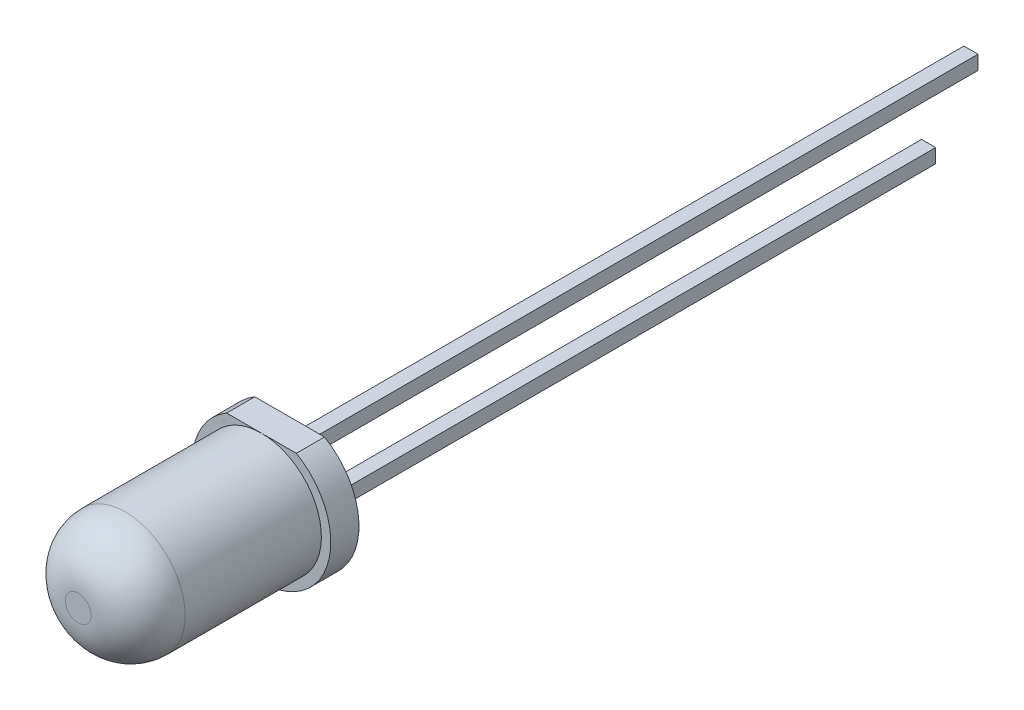
ISO-10303-21;
HEADER;
FILE_DESCRIPTION(('STEP AP214'),'2;1');
FILE_NAME('part.step','',(''),(''),'','','');
FILE_SCHEMA(('AUTOMOTIVE_DESIGN { 1 0 10303 214 1 1 1 1 }'));
ENDSEC;
DATA;
#1=APPLICATION_CONTEXT('core data for automotive mechanical design processes');
#2=APPLICATION_PROTOCOL_DEFINITION('international standard','automotive_design',2000,#1);
#3=PRODUCT_CONTEXT('',#1,'mechanical');
#4=PRODUCT('Part','Part','',(#3));
#5=PRODUCT_RELATED_PRODUCT_CATEGORY('part','',(#4));
#6=PRODUCT_DEFINITION_FORMATION('','',#4);
#7=PRODUCT_DEFINITION_CONTEXT('part definition',#1,'design');
#8=PRODUCT_DEFINITION('design','',#6,#7);
#9=PRODUCT_DEFINITION_SHAPE('','',#8);
#10=(LENGTH_UNIT() NAMED_UNIT(*) SI_UNIT(.MILLI.,.METRE.));
#11=(NAMED_UNIT(*) PLANE_ANGLE_UNIT() SI_UNIT($,.RADIAN.));
#12=(NAMED_UNIT(*) SI_UNIT($,.STERADIAN.) SOLID_ANGLE_UNIT());
#13=UNCERTAINTY_MEASURE_WITH_UNIT(LENGTH_MEASURE(1.E-05),#10,'distance_accuracy_value','');
#14=(GEOMETRIC_REPRESENTATION_CONTEXT(3) GLOBAL_UNCERTAINTY_ASSIGNED_CONTEXT((#13)) GLOBAL_UNIT_ASSIGNED_CONTEXT((#10,
#11,#12)) REPRESENTATION_CONTEXT('',''));
#15=CARTESIAN_POINT('',(0.,0.,0.));
#16=DIRECTION('',(0.,0.,1.));
#17=DIRECTION('',(1.,0.,0.));
#18=AXIS2_PLACEMENT_3D('',#15,#16,#17);
#19=CARTESIAN_POINT('',(-0.25,-0.5,3.3));
#20=DIRECTION('',(0.,0.,1.));
#21=DIRECTION('',(1.,0.,0.));
#22=AXIS2_PLACEMENT_3D('',#19,#20,#21);
#23=PLANE('',#22);
#24=DIRECTION('',(1.,0.,0.));
#25=VECTOR('',#24,1.);
#26=CARTESIAN_POINT('',(-0.25,-0.5,3.3));
#27=LINE('',#26,#25);
#28=CARTESIAN_POINT('',(-0.25,-0.5,3.3));
#29=VERTEX_POINT('',#28);
#30=CARTESIAN_POINT('',(0.25,-0.5,3.3));
#31=VERTEX_POINT('',#30);
#32=EDGE_CURVE('E55',#29,#31,#27,.T.);
#33=ORIENTED_EDGE('',*,*,#32,.T.);
#34=DIRECTION('',(0.,-1.,0.));
#35=VECTOR('',#34,1.);
#36=CARTESIAN_POINT('',(0.25,-0.5,3.3));
#37=LINE('',#36,#35);
#38=CARTESIAN_POINT('',(0.25,0.5,3.3));
#39=VERTEX_POINT('',#38);
#40=EDGE_CURVE('E92',#39,#31,#37,.T.);
#41=ORIENTED_EDGE('',*,*,#40,.F.);
#42=DIRECTION('',(1.,0.,0.));
#43=VECTOR('',#42,1.);
#44=CARTESIAN_POINT('',(-0.25,0.5,3.3));
#45=LINE('',#44,#43);
#46=CARTESIAN_POINT('',(-0.25,0.5,3.3));
#47=VERTEX_POINT('',#46);
#48=EDGE_CURVE('E12',#47,#39,#45,.T.);
#49=ORIENTED_EDGE('',*,*,#48,.F.);
#50=DIRECTION('',(0.,-1.,0.));
#51=VECTOR('',#50,1.);
#52=CARTESIAN_POINT('',(-0.25,-0.5,3.3));
#53=LINE('',#52,#51);
#54=EDGE_CURVE('E93',#47,#29,#53,.T.);
#55=ORIENTED_EDGE('',*,*,#54,.T.);
#56=EDGE_LOOP('',(#33,#41,#49,#55));
#57=FACE_BOUND('',#56,.T.);
#58=ADVANCED_FACE('F52',(#57),#23,.T.);
#59=CARTESIAN_POINT('',(-0.25,0.5,3.1));
#60=DIRECTION('',(0.,1.,0.));
#61=DIRECTION('',(0.,0.,1.));
#62=AXIS2_PLACEMENT_3D('',#59,#60,#61);
#63=PLANE('',#62);
#64=ORIENTED_EDGE('',*,*,#48,.T.);
#65=DIRECTION('',(0.,0.,1.));
#66=VECTOR('',#65,1.);
#67=CARTESIAN_POINT('',(0.25,0.5,3.1));
#68=LINE('',#67,#66);
#69=CARTESIAN_POINT('',(0.25,0.5,3.1));
#70=VERTEX_POINT('',#69);
#71=EDGE_CURVE('E109',#70,#39,#68,.T.);
#72=ORIENTED_EDGE('',*,*,#71,.F.);
#73=DIRECTION('',(1.,0.,0.));
#74=VECTOR('',#73,1.);
#75=CARTESIAN_POINT('',(-0.25,0.5,3.1));
#76=LINE('',#75,#74);
#77=CARTESIAN_POINT('',(-0.25,0.5,3.1));
#78=VERTEX_POINT('',#77);
#79=EDGE_CURVE('E60',#78,#70,#76,.T.);
#80=ORIENTED_EDGE('',*,*,#79,.F.);
#81=DIRECTION('',(0.,0.,1.));
#82=VECTOR('',#81,1.);
#83=CARTESIAN_POINT('',(-0.25,0.5,3.1));
#84=LINE('',#83,#82);
#85=EDGE_CURVE('E98',#78,#47,#84,.T.);
#86=ORIENTED_EDGE('',*,*,#85,.T.);
#87=EDGE_LOOP('',(#64,#72,#80,#86));
#88=FACE_BOUND('',#87,.T.);
#89=ADVANCED_FACE('F124',(#88),#63,.T.);
#90=CARTESIAN_POINT('',(-0.25,-0.5,3.1));
#91=DIRECTION('',(0.,0.,-1.));
#92=DIRECTION('',(-1.,0.,0.));
#93=AXIS2_PLACEMENT_3D('',#90,#91,#92);
#94=PLANE('',#93);
#95=ORIENTED_EDGE('',*,*,#79,.T.);
#96=DIRECTION('',(0.,1.,0.));
#97=VECTOR('',#96,1.);
#98=CARTESIAN_POINT('',(0.25,-0.5,3.1));
#99=LINE('',#98,#97);
#100=CARTESIAN_POINT('',(0.25,-0.5,3.1));
#101=VERTEX_POINT('',#100);
#102=EDGE_CURVE('E105',#101,#70,#99,.T.);
#103=ORIENTED_EDGE('',*,*,#102,.F.);
#104=DIRECTION('',(1.,0.,0.));
#105=VECTOR('',#104,1.);
#106=CARTESIAN_POINT('',(-0.25,-0.5,3.1));
#107=LINE('',#106,#105);
#108=CARTESIAN_POINT('',(-0.25,-0.5,3.1));
#109=VERTEX_POINT('',#108);
#110=EDGE_CURVE('E97',#109,#101,#107,.T.);
#111=ORIENTED_EDGE('',*,*,#110,.F.);
#112=DIRECTION('',(0.,1.,0.));
#113=VECTOR('',#112,1.);
#114=CARTESIAN_POINT('',(-0.25,-0.5,3.1));
#115=LINE('',#114,#113);
#116=EDGE_CURVE('E117',#109,#78,#115,.T.);
#117=ORIENTED_EDGE('',*,*,#116,.T.);
#118=EDGE_LOOP('',(#95,#103,#111,#117));
#119=FACE_BOUND('',#118,.T.);
#120=ADVANCED_FACE('F121',(#119),#94,.T.);
#121=CARTESIAN_POINT('',(-0.25,-0.5,3.1));
#122=DIRECTION('',(0.,-1.,0.));
#123=DIRECTION('',(0.,0.,-1.));
#124=AXIS2_PLACEMENT_3D('',#121,#122,#123);
#125=PLANE('',#124);
#126=ORIENTED_EDGE('',*,*,#110,.T.);
#127=DIRECTION('',(0.,0.,-1.));
#128=VECTOR('',#127,1.);
#129=CARTESIAN_POINT('',(0.25,-0.5,3.1));
#130=LINE('',#129,#128);
#131=EDGE_CURVE('E100',#31,#101,#130,.T.);
#132=ORIENTED_EDGE('',*,*,#131,.F.);
#133=ORIENTED_EDGE('',*,*,#32,.F.);
#134=DIRECTION('',(0.,0.,-1.));
#135=VECTOR('',#134,1.);
#136=CARTESIAN_POINT('',(-0.25,-0.5,3.1));
#137=LINE('',#136,#135);
#138=EDGE_CURVE('E115',#29,#109,#137,.T.);
#139=ORIENTED_EDGE('',*,*,#138,.T.);
#140=EDGE_LOOP('',(#126,#132,#133,#139));
#141=FACE_BOUND('',#140,.T.);
#142=ADVANCED_FACE('F101',(#141),#125,.T.);
#143=CARTESIAN_POINT('',(-0.25,0.,0.));
#144=DIRECTION('',(1.,0.,0.));
#145=DIRECTION('',(0.,0.,-1.));
#146=AXIS2_PLACEMENT_3D('',#143,#144,#145);
#147=PLANE('',#146);
#148=ORIENTED_EDGE('',*,*,#54,.F.);
#149=ORIENTED_EDGE('',*,*,#85,.F.);
#150=ORIENTED_EDGE('',*,*,#116,.F.);
#151=ORIENTED_EDGE('',*,*,#138,.F.);
#152=EDGE_LOOP('',(#148,#149,#150,#151));
#153=FACE_BOUND('',#152,.T.);
#154=ADVANCED_FACE('F126',(#153),#147,.F.);
#155=CARTESIAN_POINT('',(0.25,0.,0.));
#156=DIRECTION('',(1.,0.,0.));
#157=DIRECTION('',(0.,0.,-1.));
#158=AXIS2_PLACEMENT_3D('',#155,#156,#157);
#159=PLANE('',#158);
#160=ORIENTED_EDGE('',*,*,#40,.T.);
#161=ORIENTED_EDGE('',*,*,#131,.T.);
#162=ORIENTED_EDGE('',*,*,#102,.T.);
#163=ORIENTED_EDGE('',*,*,#71,.T.);
#164=EDGE_LOOP('',(#160,#161,#162,#163));
#165=FACE_BOUND('',#164,.T.);
#166=ADVANCED_FACE('F108',(#165),#159,.T.);
#167=CLOSED_SHELL('',(#58,#89,#120,#142,#154,#166));
#168=MANIFOLD_SOLID_BREP('B2',#167);
#169=CARTESIAN_POINT('',(0.,0.,1.2));
#170=DIRECTION('',(0.,0.,-1.));
#171=DIRECTION('',(-1.,0.,0.));
#172=AXIS2_PLACEMENT_3D('',#169,#170,#171);
#173=CYLINDRICAL_SURFACE('',#172,2.95);
#174=CARTESIAN_POINT('',(0.,0.,1.2));
#175=DIRECTION('',(0.,0.,1.));
#176=DIRECTION('',(1.,0.,0.));
#177=AXIS2_PLACEMENT_3D('',#174,#175,#176);
#178=CIRCLE('',#177,2.95);
#179=CARTESIAN_POINT('',(-1.48323969741914,2.55,1.2));
#180=VERTEX_POINT('',#179);
#181=CARTESIAN_POINT('',(1.48323969741914,2.55,1.2));
#182=VERTEX_POINT('',#181);
#183=EDGE_CURVE('E324',#180,#182,#178,.T.);
#184=ORIENTED_EDGE('',*,*,#183,.F.);
#185=DIRECTION('',(0.,0.,-1.));
#186=VECTOR('',#185,1.);
#187=CARTESIAN_POINT('',(-1.48323969741914,2.55,1.2));
#188=LINE('',#187,#186);
#189=CARTESIAN_POINT('',(-1.48323969741914,2.55,0.));
#190=VERTEX_POINT('',#189);
#191=EDGE_CURVE('E314',#180,#190,#188,.T.);
#192=ORIENTED_EDGE('',*,*,#191,.T.);
#193=CARTESIAN_POINT('',(0.,0.,0.));
#194=DIRECTION('',(0.,0.,1.));
#195=DIRECTION('',(1.,0.,0.));
#196=AXIS2_PLACEMENT_3D('',#193,#194,#195);
#197=CIRCLE('',#196,2.95);
#198=CARTESIAN_POINT('',(1.48323969741914,2.55,0.));
#199=VERTEX_POINT('',#198);
#200=EDGE_CURVE('E318',#190,#199,#197,.T.);
#201=ORIENTED_EDGE('',*,*,#200,.T.);
#202=DIRECTION('',(0.,0.,-1.));
#203=VECTOR('',#202,1.);
#204=CARTESIAN_POINT('',(1.48323969741914,2.55,1.2));
#205=LINE('',#204,#203);
#206=EDGE_CURVE('E310',#199,#182,#205,.F.);
#207=ORIENTED_EDGE('',*,*,#206,.T.);
#208=EDGE_LOOP('',(#184,#192,#201,#207));
#209=FACE_BOUND('',#208,.T.);
#210=ADVANCED_FACE('F192',(#209),#173,.T.);
#211=CARTESIAN_POINT('',(0.,0.,1.2));
#212=DIRECTION('',(0.,0.,1.));
#213=DIRECTION('',(1.,0.,0.));
#214=AXIS2_PLACEMENT_3D('',#211,#212,#213);
#215=PLANE('',#214);
#216=DIRECTION('',(1.,0.,0.));
#217=VECTOR('',#216,1.);
#218=CARTESIAN_POINT('',(-2.141777441338,2.55,1.2));
#219=LINE('',#218,#217);
#220=CARTESIAN_POINT('',(0.,2.55,1.2));
#221=VERTEX_POINT('',#220);
#222=EDGE_CURVE('E309',#180,#221,#219,.T.);
#223=ORIENTED_EDGE('',*,*,#222,.F.);
#224=ORIENTED_EDGE('',*,*,#183,.T.);
#225=EDGE_CURVE('E306',#221,#182,#219,.T.);
#226=ORIENTED_EDGE('',*,*,#225,.F.);
#227=CARTESIAN_POINT('',(0.,0.,1.2));
#228=DIRECTION('',(0.,0.,1.));
#229=DIRECTION('',(1.,0.,0.));
#230=AXIS2_PLACEMENT_3D('',#227,#228,#229);
#231=CIRCLE('',#230,2.55);
#232=EDGE_CURVE('E319',#221,#221,#231,.T.);
#233=ORIENTED_EDGE('',*,*,#232,.F.);
#234=EDGE_LOOP('',(#223,#224,#226,#233));
#235=FACE_BOUND('',#234,.T.);
#236=ADVANCED_FACE('F350',(#235),#215,.T.);
#237=CARTESIAN_POINT('',(0.,0.,0.));
#238=DIRECTION('',(0.,0.,1.));
#239=DIRECTION('',(1.,0.,0.));
#240=AXIS2_PLACEMENT_3D('',#237,#238,#239);
#241=PLANE('',#240);
#242=DIRECTION('',(0.,1.,0.));
#243=VECTOR('',#242,1.);
#244=CARTESIAN_POINT('',(0.3,0.97,0.));
#245=LINE('',#244,#243);
#246=CARTESIAN_POINT('',(0.3,0.97,0.));
#247=VERTEX_POINT('',#246);
#248=CARTESIAN_POINT('',(0.3,1.57,0.));
#249=VERTEX_POINT('',#248);
#250=EDGE_CURVE('E215',#247,#249,#245,.T.);
#251=ORIENTED_EDGE('',*,*,#250,.T.);
#252=DIRECTION('',(-1.,0.,0.));
#253=VECTOR('',#252,1.);
#254=CARTESIAN_POINT('',(0.3,1.57,0.));
#255=LINE('',#254,#253);
#256=CARTESIAN_POINT('',(-0.3,1.57,0.));
#257=VERTEX_POINT('',#256);
#258=EDGE_CURVE('E540',#249,#257,#255,.T.);
#259=ORIENTED_EDGE('',*,*,#258,.T.);
#260=DIRECTION('',(0.,1.,0.));
#261=VECTOR('',#260,1.);
#262=CARTESIAN_POINT('',(-0.3,0.97,0.));
#263=LINE('',#262,#261);
#264=CARTESIAN_POINT('',(-0.3,0.97,0.));
#265=VERTEX_POINT('',#264);
#266=EDGE_CURVE('E545',#265,#257,#263,.T.);
#267=ORIENTED_EDGE('',*,*,#266,.F.);
#268=DIRECTION('',(-1.,0.,0.));
#269=VECTOR('',#268,1.);
#270=CARTESIAN_POINT('',(0.3,0.97,0.));
#271=LINE('',#270,#269);
#272=EDGE_CURVE('E566',#247,#265,#271,.T.);
#273=ORIENTED_EDGE('',*,*,#272,.F.);
#274=EDGE_LOOP('',(#251,#259,#267,#273));
#275=FACE_BOUND('',#274,.T.);
#276=DIRECTION('',(0.,-1.,0.));
#277=VECTOR('',#276,1.);
#278=CARTESIAN_POINT('',(0.3,0.,0.));
#279=LINE('',#278,#277);
#280=CARTESIAN_POINT('',(0.3,-0.97,0.));
#281=VERTEX_POINT('',#280);
#282=CARTESIAN_POINT('',(0.3,-1.57,0.));
#283=VERTEX_POINT('',#282);
#284=EDGE_CURVE('E537',#281,#283,#279,.T.);
#285=ORIENTED_EDGE('',*,*,#284,.F.);
#286=DIRECTION('',(-1.,0.,0.));
#287=VECTOR('',#286,1.);
#288=CARTESIAN_POINT('',(0.,-0.97,0.));
#289=LINE('',#288,#287);
#290=CARTESIAN_POINT('',(-0.3,-0.97,0.));
#291=VERTEX_POINT('',#290);
#292=EDGE_CURVE('E538',#281,#291,#289,.T.);
#293=ORIENTED_EDGE('',*,*,#292,.T.);
#294=DIRECTION('',(0.,-1.,0.));
#295=VECTOR('',#294,1.);
#296=CARTESIAN_POINT('',(-0.3,0.,0.));
#297=LINE('',#296,#295);
#298=CARTESIAN_POINT('',(-0.3,-1.57,0.));
#299=VERTEX_POINT('',#298);
#300=EDGE_CURVE('E289',#291,#299,#297,.T.);
#301=ORIENTED_EDGE('',*,*,#300,.T.);
#302=DIRECTION('',(-1.,0.,0.));
#303=VECTOR('',#302,1.);
#304=CARTESIAN_POINT('',(0.,-1.57,0.));
#305=LINE('',#304,#303);
#306=EDGE_CURVE('E298',#283,#299,#305,.T.);
#307=ORIENTED_EDGE('',*,*,#306,.F.);
#308=EDGE_LOOP('',(#285,#293,#301,#307));
#309=FACE_BOUND('',#308,.T.);
#310=ORIENTED_EDGE('',*,*,#200,.F.);
#311=DIRECTION('',(1.,0.,0.));
#312=VECTOR('',#311,1.);
#313=CARTESIAN_POINT('',(0.,2.55,0.));
#314=LINE('',#313,#312);
#315=EDGE_CURVE('E201',#190,#199,#314,.T.);
#316=ORIENTED_EDGE('',*,*,#315,.T.);
#317=EDGE_LOOP('',(#310,#316));
#318=FACE_BOUND('',#317,.T.);
#319=ADVANCED_FACE('F341',(#275,#309,#318),#241,.F.);
#320=CARTESIAN_POINT('',(0.,0.,9.));
#321=DIRECTION('',(0.,0.,-1.));
#322=DIRECTION('',(-1.,0.,0.));
#323=AXIS2_PLACEMENT_3D('',#320,#321,#322);
#324=CYLINDRICAL_SURFACE('',#323,2.55);
#325=CARTESIAN_POINT('',(0.,0.,7.));
#326=DIRECTION('',(0.,0.,1.));
#327=DIRECTION('',(1.,0.,0.));
#328=AXIS2_PLACEMENT_3D('',#325,#326,#327);
#329=CIRCLE('',#328,2.55);
#330=CARTESIAN_POINT('',(2.55,0.,7.));
#331=VERTEX_POINT('',#330);
#332=EDGE_CURVE('E334',#331,#331,#329,.F.);
#333=ORIENTED_EDGE('',*,*,#332,.T.);
#334=EDGE_LOOP('',(#333));
#335=FACE_BOUND('',#334,.T.);
#336=ORIENTED_EDGE('',*,*,#232,.T.);
#337=EDGE_LOOP('',(#336));
#338=FACE_BOUND('',#337,.T.);
#339=ADVANCED_FACE('F353',(#335,#338),#324,.T.);
#340=CARTESIAN_POINT('',(0.,0.,9.));
#341=DIRECTION('',(0.,0.,1.));
#342=DIRECTION('',(1.,0.,0.));
#343=AXIS2_PLACEMENT_3D('',#340,#341,#342);
#344=PLANE('',#343);
#345=CARTESIAN_POINT('',(0.,0.,9.));
#346=DIRECTION('',(0.,0.,1.));
#347=DIRECTION('',(1.,0.,0.));
#348=AXIS2_PLACEMENT_3D('',#345,#346,#347);
#349=CIRCLE('',#348,0.55);
#350=CARTESIAN_POINT('',(0.55,0.,9.));
#351=VERTEX_POINT('',#350);
#352=EDGE_CURVE('E323',#351,#351,#349,.T.);
#353=ORIENTED_EDGE('',*,*,#352,.T.);
#354=EDGE_LOOP('',(#353));
#355=FACE_BOUND('',#354,.T.);
#356=ADVANCED_FACE('F355',(#355),#344,.T.);
#357=CARTESIAN_POINT('',(0.,0.,7.));
#358=DIRECTION('',(0.,0.,1.));
#359=DIRECTION('',(1.,0.,0.));
#360=AXIS2_PLACEMENT_3D('',#357,#358,#359);
#361=DEGENERATE_TOROIDAL_SURFACE('',#360,0.55,2.,.T.);
#362=ORIENTED_EDGE('',*,*,#332,.F.);
#363=EDGE_LOOP('',(#362));
#364=FACE_BOUND('',#363,.T.);
#365=ORIENTED_EDGE('',*,*,#352,.F.);
#366=EDGE_LOOP('',(#365));
#367=FACE_BOUND('',#366,.T.);
#368=ADVANCED_FACE('F194',(#364,#367),#361,.T.);
#369=CARTESIAN_POINT('',(-2.141777441338,2.55,-6.6));
#370=DIRECTION('',(0.,-1.,0.));
#371=DIRECTION('',(0.,0.,-1.));
#372=AXIS2_PLACEMENT_3D('',#369,#370,#371);
#373=PLANE('',#372);
#374=ORIENTED_EDGE('',*,*,#222,.T.);
#375=ORIENTED_EDGE('',*,*,#225,.T.);
#376=ORIENTED_EDGE('',*,*,#206,.F.);
#377=ORIENTED_EDGE('',*,*,#315,.F.);
#378=ORIENTED_EDGE('',*,*,#191,.F.);
#379=EDGE_LOOP('',(#374,#375,#376,#377,#378));
#380=FACE_BOUND('',#379,.T.);
#381=ADVANCED_FACE('F346',(#380),#373,.F.);
#382=CARTESIAN_POINT('',(0.,-0.97,-29.));
#383=DIRECTION('',(0.,1.,0.));
#384=DIRECTION('',(0.,0.,1.));
#385=AXIS2_PLACEMENT_3D('',#382,#383,#384);
#386=PLANE('',#385);
#387=DIRECTION('',(1.,0.,0.));
#388=VECTOR('',#387,1.);
#389=CARTESIAN_POINT('',(0.,-0.97,-27.2));
#390=LINE('',#389,#388);
#391=CARTESIAN_POINT('',(-0.3,-0.97,-27.2));
#392=VERTEX_POINT('',#391);
#393=CARTESIAN_POINT('',(0.3,-0.97,-27.2));
#394=VERTEX_POINT('',#393);
#395=EDGE_CURVE('E271',#392,#394,#390,.T.);
#396=ORIENTED_EDGE('',*,*,#395,.F.);
#397=DIRECTION('',(0.,0.,1.));
#398=VECTOR('',#397,1.);
#399=CARTESIAN_POINT('',(-0.3,-0.97,-29.));
#400=LINE('',#399,#398);
#401=EDGE_CURVE('E280',#392,#291,#400,.T.);
#402=ORIENTED_EDGE('',*,*,#401,.T.);
#403=ORIENTED_EDGE('',*,*,#292,.F.);
#404=DIRECTION('',(0.,0.,1.));
#405=VECTOR('',#404,1.);
#406=CARTESIAN_POINT('',(0.3,-0.97,-29.));
#407=LINE('',#406,#405);
#408=EDGE_CURVE('E282',#394,#281,#407,.T.);
#409=ORIENTED_EDGE('',*,*,#408,.F.);
#410=EDGE_LOOP('',(#396,#402,#403,#409));
#411=FACE_BOUND('',#410,.T.);
#412=ADVANCED_FACE('F278',(#411),#386,.T.);
#413=CARTESIAN_POINT('',(0.3,0.,-29.));
#414=DIRECTION('',(-1.,0.,0.));
#415=DIRECTION('',(0.,-1.,0.));
#416=AXIS2_PLACEMENT_3D('',#413,#414,#415);
#417=PLANE('',#416);
#418=DIRECTION('',(0.,0.,1.));
#419=VECTOR('',#418,1.);
#420=CARTESIAN_POINT('',(0.3,-1.57,-29.));
#421=LINE('',#420,#419);
#422=CARTESIAN_POINT('',(0.3,-1.57,-27.2));
#423=VERTEX_POINT('',#422);
#424=EDGE_CURVE('E296',#423,#283,#421,.T.);
#425=ORIENTED_EDGE('',*,*,#424,.F.);
#426=DIRECTION('',(0.,1.,0.));
#427=VECTOR('',#426,1.);
#428=CARTESIAN_POINT('',(0.3,0.,-27.2));
#429=LINE('',#428,#427);
#430=EDGE_CURVE('E285',#423,#394,#429,.T.);
#431=ORIENTED_EDGE('',*,*,#430,.T.);
#432=ORIENTED_EDGE('',*,*,#408,.T.);
#433=ORIENTED_EDGE('',*,*,#284,.T.);
#434=EDGE_LOOP('',(#425,#431,#432,#433));
#435=FACE_BOUND('',#434,.T.);
#436=ADVANCED_FACE('F444',(#435),#417,.F.);
#437=CARTESIAN_POINT('',(0.,-1.57,-29.));
#438=DIRECTION('',(0.,1.,0.));
#439=DIRECTION('',(0.,0.,1.));
#440=AXIS2_PLACEMENT_3D('',#437,#438,#439);
#441=PLANE('',#440);
#442=DIRECTION('',(0.,0.,1.));
#443=VECTOR('',#442,1.);
#444=CARTESIAN_POINT('',(-0.3,-1.57,-29.));
#445=LINE('',#444,#443);
#446=CARTESIAN_POINT('',(-0.3,-1.57,-27.2));
#447=VERTEX_POINT('',#446);
#448=EDGE_CURVE('E292',#447,#299,#445,.T.);
#449=ORIENTED_EDGE('',*,*,#448,.F.);
#450=DIRECTION('',(1.,0.,0.));
#451=VECTOR('',#450,1.);
#452=CARTESIAN_POINT('',(0.,-1.57,-27.2));
#453=LINE('',#452,#451);
#454=EDGE_CURVE('E207',#447,#423,#453,.T.);
#455=ORIENTED_EDGE('',*,*,#454,.T.);
#456=ORIENTED_EDGE('',*,*,#424,.T.);
#457=ORIENTED_EDGE('',*,*,#306,.T.);
#458=EDGE_LOOP('',(#449,#455,#456,#457));
#459=FACE_BOUND('',#458,.T.);
#460=ADVANCED_FACE('F453',(#459),#441,.F.);
#461=CARTESIAN_POINT('',(-0.3,0.,-29.));
#462=DIRECTION('',(-1.,0.,0.));
#463=DIRECTION('',(0.,-1.,0.));
#464=AXIS2_PLACEMENT_3D('',#461,#462,#463);
#465=PLANE('',#464);
#466=DIRECTION('',(0.,1.,0.));
#467=VECTOR('',#466,1.);
#468=CARTESIAN_POINT('',(-0.3,0.,-27.2));
#469=LINE('',#468,#467);
#470=EDGE_CURVE('E50',#447,#392,#469,.T.);
#471=ORIENTED_EDGE('',*,*,#470,.F.);
#472=ORIENTED_EDGE('',*,*,#448,.T.);
#473=ORIENTED_EDGE('',*,*,#300,.F.);
#474=ORIENTED_EDGE('',*,*,#401,.F.);
#475=EDGE_LOOP('',(#471,#472,#473,#474));
#476=FACE_BOUND('',#475,.T.);
#477=ADVANCED_FACE('F287',(#476),#465,.T.);
#478=CARTESIAN_POINT('',(0.3,1.57,-29.));
#479=DIRECTION('',(0.,1.,0.));
#480=DIRECTION('',(0.,0.,1.));
#481=AXIS2_PLACEMENT_3D('',#478,#479,#480);
#482=PLANE('',#481);
#483=ORIENTED_EDGE('',*,*,#258,.F.);
#484=DIRECTION('',(0.,0.,1.));
#485=VECTOR('',#484,1.);
#486=CARTESIAN_POINT('',(0.3,1.57,-29.));
#487=LINE('',#486,#485);
#488=CARTESIAN_POINT('',(0.3,1.57,-29.));
#489=VERTEX_POINT('',#488);
#490=EDGE_CURVE('E284',#489,#249,#487,.T.);
#491=ORIENTED_EDGE('',*,*,#490,.F.);
#492=DIRECTION('',(-1.,0.,0.));
#493=VECTOR('',#492,1.);
#494=CARTESIAN_POINT('',(0.3,1.57,-29.));
#495=LINE('',#494,#493);
#496=CARTESIAN_POINT('',(-0.3,1.57,-29.));
#497=VERTEX_POINT('',#496);
#498=EDGE_CURVE('E548',#489,#497,#495,.T.);
#499=ORIENTED_EDGE('',*,*,#498,.T.);
#500=DIRECTION('',(0.,0.,1.));
#501=VECTOR('',#500,1.);
#502=CARTESIAN_POINT('',(-0.3,1.57,-29.));
#503=LINE('',#502,#501);
#504=EDGE_CURVE('E561',#497,#257,#503,.T.);
#505=ORIENTED_EDGE('',*,*,#504,.T.);
#506=EDGE_LOOP('',(#483,#491,#499,#505));
#507=FACE_BOUND('',#506,.T.);
#508=ADVANCED_FACE('F386',(#507),#482,.T.);
#509=CARTESIAN_POINT('',(0.3,0.97,-29.));
#510=DIRECTION('',(1.,0.,0.));
#511=DIRECTION('',(0.,1.,0.));
#512=AXIS2_PLACEMENT_3D('',#509,#510,#511);
#513=PLANE('',#512);
#514=ORIENTED_EDGE('',*,*,#250,.F.);
#515=DIRECTION('',(0.,0.,1.));
#516=VECTOR('',#515,1.);
#517=CARTESIAN_POINT('',(0.3,0.97,-29.));
#518=LINE('',#517,#516);
#519=CARTESIAN_POINT('',(0.3,0.97,-29.));
#520=VERTEX_POINT('',#519);
#521=EDGE_CURVE('E574',#520,#247,#518,.T.);
#522=ORIENTED_EDGE('',*,*,#521,.F.);
#523=DIRECTION('',(0.,1.,0.));
#524=VECTOR('',#523,1.);
#525=CARTESIAN_POINT('',(0.3,0.97,-29.));
#526=LINE('',#525,#524);
#527=EDGE_CURVE('E558',#520,#489,#526,.T.);
#528=ORIENTED_EDGE('',*,*,#527,.T.);
#529=ORIENTED_EDGE('',*,*,#490,.T.);
#530=EDGE_LOOP('',(#514,#522,#528,#529));
#531=FACE_BOUND('',#530,.T.);
#532=ADVANCED_FACE('F391',(#531),#513,.T.);
#533=CARTESIAN_POINT('',(0.3,0.97,-29.));
#534=DIRECTION('',(0.,1.,0.));
#535=DIRECTION('',(0.,0.,1.));
#536=AXIS2_PLACEMENT_3D('',#533,#534,#535);
#537=PLANE('',#536);
#538=ORIENTED_EDGE('',*,*,#272,.T.);
#539=DIRECTION('',(0.,0.,1.));
#540=VECTOR('',#539,1.);
#541=CARTESIAN_POINT('',(-0.3,0.97,-29.));
#542=LINE('',#541,#540);
#543=CARTESIAN_POINT('',(-0.3,0.97,-29.));
#544=VERTEX_POINT('',#543);
#545=EDGE_CURVE('E578',#544,#265,#542,.T.);
#546=ORIENTED_EDGE('',*,*,#545,.F.);
#547=DIRECTION('',(-1.,0.,0.));
#548=VECTOR('',#547,1.);
#549=CARTESIAN_POINT('',(0.3,0.97,-29.));
#550=LINE('',#549,#548);
#551=EDGE_CURVE('E555',#520,#544,#550,.T.);
#552=ORIENTED_EDGE('',*,*,#551,.F.);
#553=ORIENTED_EDGE('',*,*,#521,.T.);
#554=EDGE_LOOP('',(#538,#546,#552,#553));
#555=FACE_BOUND('',#554,.T.);
#556=ADVANCED_FACE('F403',(#555),#537,.F.);
#557=CARTESIAN_POINT('',(-0.3,0.97,-29.));
#558=DIRECTION('',(1.,0.,0.));
#559=DIRECTION('',(0.,1.,0.));
#560=AXIS2_PLACEMENT_3D('',#557,#558,#559);
#561=PLANE('',#560);
#562=ORIENTED_EDGE('',*,*,#266,.T.);
#563=ORIENTED_EDGE('',*,*,#504,.F.);
#564=DIRECTION('',(0.,1.,0.));
#565=VECTOR('',#564,1.);
#566=CARTESIAN_POINT('',(-0.3,0.97,-29.));
#567=LINE('',#566,#565);
#568=EDGE_CURVE('E552',#544,#497,#567,.T.);
#569=ORIENTED_EDGE('',*,*,#568,.F.);
#570=ORIENTED_EDGE('',*,*,#545,.T.);
#571=EDGE_LOOP('',(#562,#563,#569,#570));
#572=FACE_BOUND('',#571,.T.);
#573=ADVANCED_FACE('F413',(#572),#561,.F.);
#574=CARTESIAN_POINT('',(0.,0.,-29.));
#575=DIRECTION('',(0.,0.,-1.));
#576=DIRECTION('',(-1.,0.,0.));
#577=AXIS2_PLACEMENT_3D('',#574,#575,#576);
#578=PLANE('',#577);
#579=ORIENTED_EDGE('',*,*,#498,.F.);
#580=ORIENTED_EDGE('',*,*,#527,.F.);
#581=ORIENTED_EDGE('',*,*,#551,.T.);
#582=ORIENTED_EDGE('',*,*,#568,.T.);
#583=EDGE_LOOP('',(#579,#580,#581,#582));
#584=FACE_BOUND('',#583,.T.);
#585=ADVANCED_FACE('F423',(#584),#578,.T.);
#586=CARTESIAN_POINT('',(0.,0.,-27.2));
#587=DIRECTION('',(0.,0.,1.));
#588=DIRECTION('',(1.,0.,0.));
#589=AXIS2_PLACEMENT_3D('',#586,#587,#588);
#590=PLANE('',#589);
#591=ORIENTED_EDGE('',*,*,#395,.T.);
#592=ORIENTED_EDGE('',*,*,#430,.F.);
#593=ORIENTED_EDGE('',*,*,#454,.F.);
#594=ORIENTED_EDGE('',*,*,#470,.T.);
#595=EDGE_LOOP('',(#591,#592,#593,#594));
#596=FACE_BOUND('',#595,.T.);
#597=ADVANCED_FACE('F270',(#596),#590,.F.);
#598=CLOSED_SHELL('',(#210,#236,#319,#339,#356,#368,#381,#412,#436,#460,#477,#508,#532,#556,
#573,#585,#597));
#599=MANIFOLD_SOLID_BREP('B6',#598);
#600=ADVANCED_BREP_SHAPE_REPRESENTATION('',(#18,#168,#599),#14);
#601=SHAPE_DEFINITION_REPRESENTATION(#9,#600);
ENDSEC;
END-ISO-10303-21;
